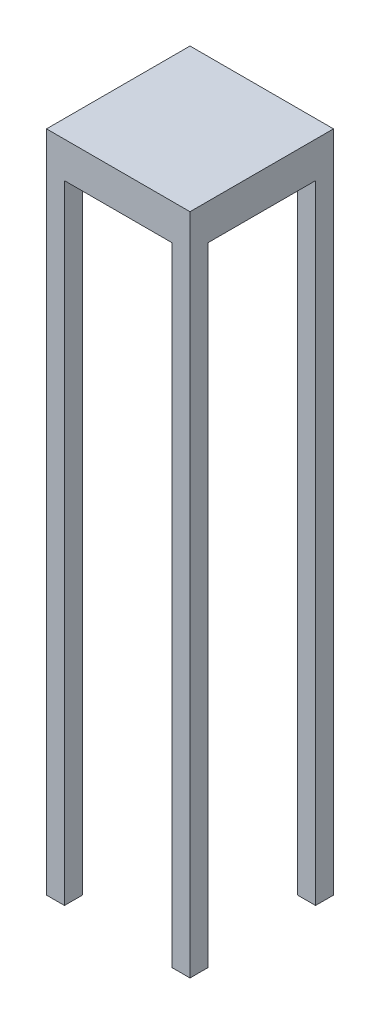
ISO-10303-21;
HEADER;
FILE_DESCRIPTION(('STEP AP214'),'2;1');
FILE_NAME('part.step','',(''),(''),'','','');
FILE_SCHEMA(('AUTOMOTIVE_DESIGN { 1 0 10303 214 1 1 1 1 }'));
ENDSEC;
DATA;
#1=APPLICATION_CONTEXT('core data for automotive mechanical design processes');
#2=APPLICATION_PROTOCOL_DEFINITION('international standard','automotive_design',2000,#1);
#3=PRODUCT_CONTEXT('',#1,'mechanical');
#4=PRODUCT('Part','Part','',(#3));
#5=PRODUCT_RELATED_PRODUCT_CATEGORY('part','',(#4));
#6=PRODUCT_DEFINITION_FORMATION('','',#4);
#7=PRODUCT_DEFINITION_CONTEXT('part definition',#1,'design');
#8=PRODUCT_DEFINITION('design','',#6,#7);
#9=PRODUCT_DEFINITION_SHAPE('','',#8);
#10=(LENGTH_UNIT() NAMED_UNIT(*) SI_UNIT(.MILLI.,.METRE.));
#11=(NAMED_UNIT(*) PLANE_ANGLE_UNIT() SI_UNIT($,.RADIAN.));
#12=(NAMED_UNIT(*) SI_UNIT($,.STERADIAN.) SOLID_ANGLE_UNIT());
#13=UNCERTAINTY_MEASURE_WITH_UNIT(LENGTH_MEASURE(1.E-05),#10,'distance_accuracy_value','');
#14=(GEOMETRIC_REPRESENTATION_CONTEXT(3) GLOBAL_UNCERTAINTY_ASSIGNED_CONTEXT((#13)) GLOBAL_UNIT_ASSIGNED_CONTEXT((#10,
#11,#12)) REPRESENTATION_CONTEXT('',''));
#15=CARTESIAN_POINT('',(0.,0.,0.));
#16=DIRECTION('',(0.,0.,1.));
#17=DIRECTION('',(1.,0.,0.));
#18=AXIS2_PLACEMENT_3D('',#15,#16,#17);
#19=CARTESIAN_POINT('',(0.,0.,0.));
#20=DIRECTION('',(0.,-1.,0.));
#21=DIRECTION('',(0.,0.,-1.));
#22=AXIS2_PLACEMENT_3D('',#19,#20,#21);
#23=PLANE('',#22);
#24=DIRECTION('',(0.,0.,-1.));
#25=VECTOR('',#24,1.);
#26=CARTESIAN_POINT('',(175.,0.,-200.));
#27=LINE('',#26,#25);
#28=CARTESIAN_POINT('',(175.,0.,-175.));
#29=VERTEX_POINT('',#28);
#30=CARTESIAN_POINT('',(175.,0.,-200.));
#31=VERTEX_POINT('',#30);
#32=EDGE_CURVE('E164',#29,#31,#27,.T.);
#33=ORIENTED_EDGE('',*,*,#32,.F.);
#34=DIRECTION('',(-1.,0.,0.));
#35=VECTOR('',#34,1.);
#36=CARTESIAN_POINT('',(200.,0.,-175.));
#37=LINE('',#36,#35);
#38=CARTESIAN_POINT('',(200.,0.,-175.));
#39=VERTEX_POINT('',#38);
#40=EDGE_CURVE('E276',#39,#29,#37,.T.);
#41=ORIENTED_EDGE('',*,*,#40,.F.);
#42=DIRECTION('',(0.,0.,-1.));
#43=VECTOR('',#42,1.);
#44=CARTESIAN_POINT('',(200.,0.,0.));
#45=LINE('',#44,#43);
#46=CARTESIAN_POINT('',(200.,0.,-25.));
#47=VERTEX_POINT('',#46);
#48=EDGE_CURVE('E170',#47,#39,#45,.T.);
#49=ORIENTED_EDGE('',*,*,#48,.F.);
#50=DIRECTION('',(1.,0.,0.));
#51=VECTOR('',#50,1.);
#52=CARTESIAN_POINT('',(200.,0.,-25.));
#53=LINE('',#52,#51);
#54=CARTESIAN_POINT('',(175.,0.,-25.));
#55=VERTEX_POINT('',#54);
#56=EDGE_CURVE('E202',#55,#47,#53,.T.);
#57=ORIENTED_EDGE('',*,*,#56,.F.);
#58=DIRECTION('',(0.,0.,-1.));
#59=VECTOR('',#58,1.);
#60=CARTESIAN_POINT('',(175.,0.,0.));
#61=LINE('',#60,#59);
#62=CARTESIAN_POINT('',(175.,0.,0.));
#63=VERTEX_POINT('',#62);
#64=EDGE_CURVE('E197',#63,#55,#61,.T.);
#65=ORIENTED_EDGE('',*,*,#64,.F.);
#66=DIRECTION('',(1.,0.,0.));
#67=VECTOR('',#66,1.);
#68=CARTESIAN_POINT('',(0.,0.,0.));
#69=LINE('',#68,#67);
#70=CARTESIAN_POINT('',(25.,0.,0.));
#71=VERTEX_POINT('',#70);
#72=EDGE_CURVE('E253',#71,#63,#69,.T.);
#73=ORIENTED_EDGE('',*,*,#72,.F.);
#74=DIRECTION('',(0.,0.,1.));
#75=VECTOR('',#74,1.);
#76=CARTESIAN_POINT('',(25.,0.,0.));
#77=LINE('',#76,#75);
#78=CARTESIAN_POINT('',(25.,0.,-25.));
#79=VERTEX_POINT('',#78);
#80=EDGE_CURVE('E220',#79,#71,#77,.T.);
#81=ORIENTED_EDGE('',*,*,#80,.F.);
#82=DIRECTION('',(1.,0.,0.));
#83=VECTOR('',#82,1.);
#84=CARTESIAN_POINT('',(0.,0.,-25.));
#85=LINE('',#84,#83);
#86=CARTESIAN_POINT('',(0.,0.,-25.));
#87=VERTEX_POINT('',#86);
#88=EDGE_CURVE('E215',#87,#79,#85,.T.);
#89=ORIENTED_EDGE('',*,*,#88,.F.);
#90=DIRECTION('',(0.,0.,1.));
#91=VECTOR('',#90,1.);
#92=CARTESIAN_POINT('',(0.,0.,0.));
#93=LINE('',#92,#91);
#94=CARTESIAN_POINT('',(0.,0.,-175.));
#95=VERTEX_POINT('',#94);
#96=EDGE_CURVE('E240',#95,#87,#93,.T.);
#97=ORIENTED_EDGE('',*,*,#96,.F.);
#98=DIRECTION('',(-1.,0.,0.));
#99=VECTOR('',#98,1.);
#100=CARTESIAN_POINT('',(0.,0.,-175.));
#101=LINE('',#100,#99);
#102=CARTESIAN_POINT('',(25.,0.,-175.));
#103=VERTEX_POINT('',#102);
#104=EDGE_CURVE('E173',#103,#95,#101,.T.);
#105=ORIENTED_EDGE('',*,*,#104,.F.);
#106=DIRECTION('',(0.,0.,1.));
#107=VECTOR('',#106,1.);
#108=CARTESIAN_POINT('',(25.,0.,-200.));
#109=LINE('',#108,#107);
#110=CARTESIAN_POINT('',(25.,0.,-200.));
#111=VERTEX_POINT('',#110);
#112=EDGE_CURVE('E171',#111,#103,#109,.T.);
#113=ORIENTED_EDGE('',*,*,#112,.F.);
#114=DIRECTION('',(-1.,0.,0.));
#115=VECTOR('',#114,1.);
#116=CARTESIAN_POINT('',(0.,0.,-200.));
#117=LINE('',#116,#115);
#118=EDGE_CURVE('E245',#31,#111,#117,.T.);
#119=ORIENTED_EDGE('',*,*,#118,.F.);
#120=EDGE_LOOP('',(#33,#41,#49,#57,#65,#73,#81,#89,#97,#105,#113,#119));
#121=FACE_BOUND('',#120,.T.);
#122=ADVANCED_FACE('F32',(#121),#23,.T.);
#123=CARTESIAN_POINT('',(0.,50.,0.));
#124=DIRECTION('',(1.,0.,0.));
#125=DIRECTION('',(0.,0.,-1.));
#126=AXIS2_PLACEMENT_3D('',#123,#124,#125);
#127=PLANE('',#126);
#128=DIRECTION('',(0.,-1.,0.));
#129=VECTOR('',#128,1.);
#130=CARTESIAN_POINT('',(0.,50.,-200.));
#131=LINE('',#130,#129);
#132=CARTESIAN_POINT('',(0.,50.,-200.));
#133=VERTEX_POINT('',#132);
#134=CARTESIAN_POINT('',(0.,-875.,-200.));
#135=VERTEX_POINT('',#134);
#136=EDGE_CURVE('E251',#133,#135,#131,.T.);
#137=ORIENTED_EDGE('',*,*,#136,.T.);
#138=DIRECTION('',(0.,0.,-1.));
#139=VECTOR('',#138,1.);
#140=CARTESIAN_POINT('',(0.,-875.,-200.));
#141=LINE('',#140,#139);
#142=CARTESIAN_POINT('',(0.,-875.,-175.));
#143=VERTEX_POINT('',#142);
#144=EDGE_CURVE('E178',#143,#135,#141,.T.);
#145=ORIENTED_EDGE('',*,*,#144,.F.);
#146=DIRECTION('',(0.,1.,0.));
#147=VECTOR('',#146,1.);
#148=CARTESIAN_POINT('',(0.,-875.,-175.));
#149=LINE('',#148,#147);
#150=EDGE_CURVE('E186',#143,#95,#149,.T.);
#151=ORIENTED_EDGE('',*,*,#150,.T.);
#152=ORIENTED_EDGE('',*,*,#96,.T.);
#153=DIRECTION('',(0.,1.,0.));
#154=VECTOR('',#153,1.);
#155=CARTESIAN_POINT('',(0.,-875.,-25.));
#156=LINE('',#155,#154);
#157=CARTESIAN_POINT('',(0.,-875.,-25.));
#158=VERTEX_POINT('',#157);
#159=EDGE_CURVE('E237',#158,#87,#156,.T.);
#160=ORIENTED_EDGE('',*,*,#159,.F.);
#161=DIRECTION('',(0.,0.,-1.));
#162=VECTOR('',#161,1.);
#163=CARTESIAN_POINT('',(0.,-875.,0.));
#164=LINE('',#163,#162);
#165=CARTESIAN_POINT('',(0.,-875.,0.));
#166=VERTEX_POINT('',#165);
#167=EDGE_CURVE('E216',#166,#158,#164,.T.);
#168=ORIENTED_EDGE('',*,*,#167,.F.);
#169=DIRECTION('',(0.,-1.,0.));
#170=VECTOR('',#169,1.);
#171=CARTESIAN_POINT('',(0.,50.,0.));
#172=LINE('',#171,#170);
#173=CARTESIAN_POINT('',(0.,50.,0.));
#174=VERTEX_POINT('',#173);
#175=EDGE_CURVE('E11',#174,#166,#172,.T.);
#176=ORIENTED_EDGE('',*,*,#175,.F.);
#177=DIRECTION('',(0.,0.,1.));
#178=VECTOR('',#177,1.);
#179=CARTESIAN_POINT('',(0.,50.,0.));
#180=LINE('',#179,#178);
#181=EDGE_CURVE('E241',#133,#174,#180,.T.);
#182=ORIENTED_EDGE('',*,*,#181,.F.);
#183=EDGE_LOOP('',(#137,#145,#151,#152,#160,#168,#176,#182));
#184=FACE_BOUND('',#183,.T.);
#185=ADVANCED_FACE('F34',(#184),#127,.F.);
#186=CARTESIAN_POINT('',(0.,50.,0.));
#187=DIRECTION('',(0.,0.,-1.));
#188=DIRECTION('',(-1.,0.,0.));
#189=AXIS2_PLACEMENT_3D('',#186,#187,#188);
#190=PLANE('',#189);
#191=ORIENTED_EDGE('',*,*,#175,.T.);
#192=DIRECTION('',(-1.,0.,0.));
#193=VECTOR('',#192,1.);
#194=CARTESIAN_POINT('',(0.,-875.,0.));
#195=LINE('',#194,#193);
#196=CARTESIAN_POINT('',(25.,-875.,0.));
#197=VERTEX_POINT('',#196);
#198=EDGE_CURVE('E224',#197,#166,#195,.T.);
#199=ORIENTED_EDGE('',*,*,#198,.F.);
#200=DIRECTION('',(0.,1.,0.));
#201=VECTOR('',#200,1.);
#202=CARTESIAN_POINT('',(25.,-875.,0.));
#203=LINE('',#202,#201);
#204=EDGE_CURVE('E227',#197,#71,#203,.T.);
#205=ORIENTED_EDGE('',*,*,#204,.T.);
#206=ORIENTED_EDGE('',*,*,#72,.T.);
#207=DIRECTION('',(0.,1.,0.));
#208=VECTOR('',#207,1.);
#209=CARTESIAN_POINT('',(175.,-875.,0.));
#210=LINE('',#209,#208);
#211=CARTESIAN_POINT('',(175.,-875.,0.));
#212=VERTEX_POINT('',#211);
#213=EDGE_CURVE('E213',#212,#63,#210,.T.);
#214=ORIENTED_EDGE('',*,*,#213,.F.);
#215=DIRECTION('',(-1.,0.,0.));
#216=VECTOR('',#215,1.);
#217=CARTESIAN_POINT('',(200.,-875.,0.));
#218=LINE('',#217,#216);
#219=CARTESIAN_POINT('',(200.,-875.,0.));
#220=VERTEX_POINT('',#219);
#221=EDGE_CURVE('E201',#220,#212,#218,.T.);
#222=ORIENTED_EDGE('',*,*,#221,.F.);
#223=DIRECTION('',(0.,-1.,0.));
#224=VECTOR('',#223,1.);
#225=CARTESIAN_POINT('',(200.,50.,0.));
#226=LINE('',#225,#224);
#227=CARTESIAN_POINT('',(200.,50.,0.));
#228=VERTEX_POINT('',#227);
#229=EDGE_CURVE('E40',#228,#220,#226,.T.);
#230=ORIENTED_EDGE('',*,*,#229,.F.);
#231=DIRECTION('',(1.,0.,0.));
#232=VECTOR('',#231,1.);
#233=CARTESIAN_POINT('',(0.,50.,0.));
#234=LINE('',#233,#232);
#235=EDGE_CURVE('E244',#174,#228,#234,.T.);
#236=ORIENTED_EDGE('',*,*,#235,.F.);
#237=EDGE_LOOP('',(#191,#199,#205,#206,#214,#222,#230,#236));
#238=FACE_BOUND('',#237,.T.);
#239=ADVANCED_FACE('F266',(#238),#190,.F.);
#240=CARTESIAN_POINT('',(200.,50.,0.));
#241=DIRECTION('',(-1.,0.,0.));
#242=DIRECTION('',(0.,0.,1.));
#243=AXIS2_PLACEMENT_3D('',#240,#241,#242);
#244=PLANE('',#243);
#245=ORIENTED_EDGE('',*,*,#229,.T.);
#246=DIRECTION('',(0.,0.,1.));
#247=VECTOR('',#246,1.);
#248=CARTESIAN_POINT('',(200.,-875.,0.));
#249=LINE('',#248,#247);
#250=CARTESIAN_POINT('',(200.,-875.,-25.));
#251=VERTEX_POINT('',#250);
#252=EDGE_CURVE('E198',#251,#220,#249,.T.);
#253=ORIENTED_EDGE('',*,*,#252,.F.);
#254=DIRECTION('',(0.,1.,0.));
#255=VECTOR('',#254,1.);
#256=CARTESIAN_POINT('',(200.,-875.,-25.));
#257=LINE('',#256,#255);
#258=EDGE_CURVE('E208',#251,#47,#257,.T.);
#259=ORIENTED_EDGE('',*,*,#258,.T.);
#260=ORIENTED_EDGE('',*,*,#48,.T.);
#261=DIRECTION('',(0.,1.,0.));
#262=VECTOR('',#261,1.);
#263=CARTESIAN_POINT('',(200.,-875.,-175.));
#264=LINE('',#263,#262);
#265=CARTESIAN_POINT('',(200.,-875.,-175.));
#266=VERTEX_POINT('',#265);
#267=EDGE_CURVE('E149',#266,#39,#264,.T.);
#268=ORIENTED_EDGE('',*,*,#267,.F.);
#269=DIRECTION('',(0.,0.,1.));
#270=VECTOR('',#269,1.);
#271=CARTESIAN_POINT('',(200.,-875.,-200.));
#272=LINE('',#271,#270);
#273=CARTESIAN_POINT('',(200.,-875.,-200.));
#274=VERTEX_POINT('',#273);
#275=EDGE_CURVE('E156',#274,#266,#272,.T.);
#276=ORIENTED_EDGE('',*,*,#275,.F.);
#277=DIRECTION('',(0.,-1.,0.));
#278=VECTOR('',#277,1.);
#279=CARTESIAN_POINT('',(200.,50.,-200.));
#280=LINE('',#279,#278);
#281=CARTESIAN_POINT('',(200.,50.,-200.));
#282=VERTEX_POINT('',#281);
#283=EDGE_CURVE('E259',#282,#274,#280,.T.);
#284=ORIENTED_EDGE('',*,*,#283,.F.);
#285=DIRECTION('',(0.,0.,-1.));
#286=VECTOR('',#285,1.);
#287=CARTESIAN_POINT('',(200.,50.,0.));
#288=LINE('',#287,#286);
#289=EDGE_CURVE('E247',#228,#282,#288,.T.);
#290=ORIENTED_EDGE('',*,*,#289,.F.);
#291=EDGE_LOOP('',(#245,#253,#259,#260,#268,#276,#284,#290));
#292=FACE_BOUND('',#291,.T.);
#293=ADVANCED_FACE('F167',(#292),#244,.F.);
#294=CARTESIAN_POINT('',(0.,50.,-200.));
#295=DIRECTION('',(0.,0.,1.));
#296=DIRECTION('',(1.,0.,0.));
#297=AXIS2_PLACEMENT_3D('',#294,#295,#296);
#298=PLANE('',#297);
#299=ORIENTED_EDGE('',*,*,#283,.T.);
#300=DIRECTION('',(1.,0.,0.));
#301=VECTOR('',#300,1.);
#302=CARTESIAN_POINT('',(200.,-875.,-200.));
#303=LINE('',#302,#301);
#304=CARTESIAN_POINT('',(175.,-875.,-200.));
#305=VERTEX_POINT('',#304);
#306=EDGE_CURVE('E161',#305,#274,#303,.T.);
#307=ORIENTED_EDGE('',*,*,#306,.F.);
#308=DIRECTION('',(0.,1.,0.));
#309=VECTOR('',#308,1.);
#310=CARTESIAN_POINT('',(175.,-875.,-200.));
#311=LINE('',#310,#309);
#312=EDGE_CURVE('E47',#305,#31,#311,.T.);
#313=ORIENTED_EDGE('',*,*,#312,.T.);
#314=ORIENTED_EDGE('',*,*,#118,.T.);
#315=DIRECTION('',(0.,1.,0.));
#316=VECTOR('',#315,1.);
#317=CARTESIAN_POINT('',(25.,-875.,-200.));
#318=LINE('',#317,#316);
#319=CARTESIAN_POINT('',(25.,-875.,-200.));
#320=VERTEX_POINT('',#319);
#321=EDGE_CURVE('E194',#320,#111,#318,.T.);
#322=ORIENTED_EDGE('',*,*,#321,.F.);
#323=DIRECTION('',(1.,0.,0.));
#324=VECTOR('',#323,1.);
#325=CARTESIAN_POINT('',(0.,-875.,-200.));
#326=LINE('',#325,#324);
#327=EDGE_CURVE('E181',#135,#320,#326,.T.);
#328=ORIENTED_EDGE('',*,*,#327,.F.);
#329=ORIENTED_EDGE('',*,*,#136,.F.);
#330=DIRECTION('',(-1.,0.,0.));
#331=VECTOR('',#330,1.);
#332=CARTESIAN_POINT('',(0.,50.,-200.));
#333=LINE('',#332,#331);
#334=EDGE_CURVE('E249',#282,#133,#333,.T.);
#335=ORIENTED_EDGE('',*,*,#334,.F.);
#336=EDGE_LOOP('',(#299,#307,#313,#314,#322,#328,#329,#335));
#337=FACE_BOUND('',#336,.T.);
#338=ADVANCED_FACE('F284',(#337),#298,.F.);
#339=CARTESIAN_POINT('',(0.,50.,0.));
#340=DIRECTION('',(0.,-1.,0.));
#341=DIRECTION('',(0.,0.,-1.));
#342=AXIS2_PLACEMENT_3D('',#339,#340,#341);
#343=PLANE('',#342);
#344=ORIENTED_EDGE('',*,*,#181,.T.);
#345=ORIENTED_EDGE('',*,*,#235,.T.);
#346=ORIENTED_EDGE('',*,*,#289,.T.);
#347=ORIENTED_EDGE('',*,*,#334,.T.);
#348=EDGE_LOOP('',(#344,#345,#346,#347));
#349=FACE_BOUND('',#348,.T.);
#350=ADVANCED_FACE('F290',(#349),#343,.F.);
#351=CARTESIAN_POINT('',(0.,-875.,-25.));
#352=DIRECTION('',(0.,0.,1.));
#353=DIRECTION('',(1.,0.,0.));
#354=AXIS2_PLACEMENT_3D('',#351,#352,#353);
#355=PLANE('',#354);
#356=ORIENTED_EDGE('',*,*,#88,.T.);
#357=DIRECTION('',(0.,1.,0.));
#358=VECTOR('',#357,1.);
#359=CARTESIAN_POINT('',(25.,-875.,-25.));
#360=LINE('',#359,#358);
#361=CARTESIAN_POINT('',(25.,-875.,-25.));
#362=VERTEX_POINT('',#361);
#363=EDGE_CURVE('E234',#362,#79,#360,.T.);
#364=ORIENTED_EDGE('',*,*,#363,.F.);
#365=DIRECTION('',(1.,0.,0.));
#366=VECTOR('',#365,1.);
#367=CARTESIAN_POINT('',(0.,-875.,-25.));
#368=LINE('',#367,#366);
#369=EDGE_CURVE('E219',#158,#362,#368,.T.);
#370=ORIENTED_EDGE('',*,*,#369,.F.);
#371=ORIENTED_EDGE('',*,*,#159,.T.);
#372=EDGE_LOOP('',(#356,#364,#370,#371));
#373=FACE_BOUND('',#372,.T.);
#374=ADVANCED_FACE('F303',(#373),#355,.F.);
#375=CARTESIAN_POINT('',(25.,-875.,0.));
#376=DIRECTION('',(-1.,0.,0.));
#377=DIRECTION('',(0.,0.,1.));
#378=AXIS2_PLACEMENT_3D('',#375,#376,#377);
#379=PLANE('',#378);
#380=ORIENTED_EDGE('',*,*,#80,.T.);
#381=ORIENTED_EDGE('',*,*,#204,.F.);
#382=DIRECTION('',(0.,0.,1.));
#383=VECTOR('',#382,1.);
#384=CARTESIAN_POINT('',(25.,-875.,0.));
#385=LINE('',#384,#383);
#386=EDGE_CURVE('E222',#362,#197,#385,.T.);
#387=ORIENTED_EDGE('',*,*,#386,.F.);
#388=ORIENTED_EDGE('',*,*,#363,.T.);
#389=EDGE_LOOP('',(#380,#381,#387,#388));
#390=FACE_BOUND('',#389,.T.);
#391=ADVANCED_FACE('F306',(#390),#379,.F.);
#392=CARTESIAN_POINT('',(0.,-875.,0.));
#393=DIRECTION('',(0.,-1.,0.));
#394=DIRECTION('',(0.,0.,-1.));
#395=AXIS2_PLACEMENT_3D('',#392,#393,#394);
#396=PLANE('',#395);
#397=ORIENTED_EDGE('',*,*,#167,.T.);
#398=ORIENTED_EDGE('',*,*,#369,.T.);
#399=ORIENTED_EDGE('',*,*,#386,.T.);
#400=ORIENTED_EDGE('',*,*,#198,.T.);
#401=EDGE_LOOP('',(#397,#398,#399,#400));
#402=FACE_BOUND('',#401,.T.);
#403=ADVANCED_FACE('F296',(#402),#396,.T.);
#404=CARTESIAN_POINT('',(175.,-875.,0.));
#405=DIRECTION('',(1.,0.,0.));
#406=DIRECTION('',(0.,0.,-1.));
#407=AXIS2_PLACEMENT_3D('',#404,#405,#406);
#408=PLANE('',#407);
#409=ORIENTED_EDGE('',*,*,#64,.T.);
#410=DIRECTION('',(0.,1.,0.));
#411=VECTOR('',#410,1.);
#412=CARTESIAN_POINT('',(175.,-875.,-25.));
#413=LINE('',#412,#411);
#414=CARTESIAN_POINT('',(175.,-875.,-25.));
#415=VERTEX_POINT('',#414);
#416=EDGE_CURVE('E55',#415,#55,#413,.T.);
#417=ORIENTED_EDGE('',*,*,#416,.F.);
#418=DIRECTION('',(0.,0.,-1.));
#419=VECTOR('',#418,1.);
#420=CARTESIAN_POINT('',(175.,-875.,0.));
#421=LINE('',#420,#419);
#422=EDGE_CURVE('E204',#212,#415,#421,.T.);
#423=ORIENTED_EDGE('',*,*,#422,.F.);
#424=ORIENTED_EDGE('',*,*,#213,.T.);
#425=EDGE_LOOP('',(#409,#417,#423,#424));
#426=FACE_BOUND('',#425,.T.);
#427=ADVANCED_FACE('F308',(#426),#408,.F.);
#428=CARTESIAN_POINT('',(200.,-875.,-25.));
#429=DIRECTION('',(0.,0.,1.));
#430=DIRECTION('',(1.,0.,0.));
#431=AXIS2_PLACEMENT_3D('',#428,#429,#430);
#432=PLANE('',#431);
#433=ORIENTED_EDGE('',*,*,#56,.T.);
#434=ORIENTED_EDGE('',*,*,#258,.F.);
#435=DIRECTION('',(1.,0.,0.));
#436=VECTOR('',#435,1.);
#437=CARTESIAN_POINT('',(200.,-875.,-25.));
#438=LINE('',#437,#436);
#439=EDGE_CURVE('E206',#415,#251,#438,.T.);
#440=ORIENTED_EDGE('',*,*,#439,.F.);
#441=ORIENTED_EDGE('',*,*,#416,.T.);
#442=EDGE_LOOP('',(#433,#434,#440,#441));
#443=FACE_BOUND('',#442,.T.);
#444=ADVANCED_FACE('F271',(#443),#432,.F.);
#445=CARTESIAN_POINT('',(0.,-875.,0.));
#446=DIRECTION('',(0.,1.,0.));
#447=DIRECTION('',(0.,0.,1.));
#448=AXIS2_PLACEMENT_3D('',#445,#446,#447);
#449=PLANE('',#448);
#450=ORIENTED_EDGE('',*,*,#252,.T.);
#451=ORIENTED_EDGE('',*,*,#221,.T.);
#452=ORIENTED_EDGE('',*,*,#422,.T.);
#453=ORIENTED_EDGE('',*,*,#439,.T.);
#454=EDGE_LOOP('',(#450,#451,#452,#453));
#455=FACE_BOUND('',#454,.T.);
#456=ADVANCED_FACE('F269',(#455),#449,.F.);
#457=CARTESIAN_POINT('',(25.,-875.,-200.));
#458=DIRECTION('',(-1.,0.,0.));
#459=DIRECTION('',(0.,0.,1.));
#460=AXIS2_PLACEMENT_3D('',#457,#458,#459);
#461=PLANE('',#460);
#462=ORIENTED_EDGE('',*,*,#112,.T.);
#463=DIRECTION('',(0.,1.,0.));
#464=VECTOR('',#463,1.);
#465=CARTESIAN_POINT('',(25.,-875.,-175.));
#466=LINE('',#465,#464);
#467=CARTESIAN_POINT('',(25.,-875.,-175.));
#468=VERTEX_POINT('',#467);
#469=EDGE_CURVE('E191',#468,#103,#466,.T.);
#470=ORIENTED_EDGE('',*,*,#469,.F.);
#471=DIRECTION('',(0.,0.,1.));
#472=VECTOR('',#471,1.);
#473=CARTESIAN_POINT('',(25.,-875.,-200.));
#474=LINE('',#473,#472);
#475=EDGE_CURVE('E183',#320,#468,#474,.T.);
#476=ORIENTED_EDGE('',*,*,#475,.F.);
#477=ORIENTED_EDGE('',*,*,#321,.T.);
#478=EDGE_LOOP('',(#462,#470,#476,#477));
#479=FACE_BOUND('',#478,.T.);
#480=ADVANCED_FACE('F380',(#479),#461,.F.);
#481=CARTESIAN_POINT('',(0.,-875.,-175.));
#482=DIRECTION('',(0.,0.,-1.));
#483=DIRECTION('',(-1.,0.,0.));
#484=AXIS2_PLACEMENT_3D('',#481,#482,#483);
#485=PLANE('',#484);
#486=ORIENTED_EDGE('',*,*,#104,.T.);
#487=ORIENTED_EDGE('',*,*,#150,.F.);
#488=DIRECTION('',(-1.,0.,0.));
#489=VECTOR('',#488,1.);
#490=CARTESIAN_POINT('',(0.,-875.,-175.));
#491=LINE('',#490,#489);
#492=EDGE_CURVE('E185',#468,#143,#491,.T.);
#493=ORIENTED_EDGE('',*,*,#492,.F.);
#494=ORIENTED_EDGE('',*,*,#469,.T.);
#495=EDGE_LOOP('',(#486,#487,#493,#494));
#496=FACE_BOUND('',#495,.T.);
#497=ADVANCED_FACE('F389',(#496),#485,.F.);
#498=CARTESIAN_POINT('',(0.,-875.,0.));
#499=DIRECTION('',(0.,1.,0.));
#500=DIRECTION('',(0.,0.,1.));
#501=AXIS2_PLACEMENT_3D('',#498,#499,#500);
#502=PLANE('',#501);
#503=ORIENTED_EDGE('',*,*,#144,.T.);
#504=ORIENTED_EDGE('',*,*,#327,.T.);
#505=ORIENTED_EDGE('',*,*,#475,.T.);
#506=ORIENTED_EDGE('',*,*,#492,.T.);
#507=EDGE_LOOP('',(#503,#504,#505,#506));
#508=FACE_BOUND('',#507,.T.);
#509=ADVANCED_FACE('F399',(#508),#502,.F.);
#510=CARTESIAN_POINT('',(200.,-875.,-175.));
#511=DIRECTION('',(0.,0.,-1.));
#512=DIRECTION('',(-1.,0.,0.));
#513=AXIS2_PLACEMENT_3D('',#510,#511,#512);
#514=PLANE('',#513);
#515=ORIENTED_EDGE('',*,*,#40,.T.);
#516=DIRECTION('',(0.,1.,0.));
#517=VECTOR('',#516,1.);
#518=CARTESIAN_POINT('',(175.,-875.,-175.));
#519=LINE('',#518,#517);
#520=CARTESIAN_POINT('',(175.,-875.,-175.));
#521=VERTEX_POINT('',#520);
#522=EDGE_CURVE('E152',#521,#29,#519,.T.);
#523=ORIENTED_EDGE('',*,*,#522,.F.);
#524=DIRECTION('',(-1.,0.,0.));
#525=VECTOR('',#524,1.);
#526=CARTESIAN_POINT('',(200.,-875.,-175.));
#527=LINE('',#526,#525);
#528=EDGE_CURVE('E145',#266,#521,#527,.T.);
#529=ORIENTED_EDGE('',*,*,#528,.F.);
#530=ORIENTED_EDGE('',*,*,#267,.T.);
#531=EDGE_LOOP('',(#515,#523,#529,#530));
#532=FACE_BOUND('',#531,.T.);
#533=ADVANCED_FACE('F147',(#532),#514,.F.);
#534=CARTESIAN_POINT('',(175.,-875.,-200.));
#535=DIRECTION('',(1.,0.,0.));
#536=DIRECTION('',(0.,0.,-1.));
#537=AXIS2_PLACEMENT_3D('',#534,#535,#536);
#538=PLANE('',#537);
#539=ORIENTED_EDGE('',*,*,#32,.T.);
#540=ORIENTED_EDGE('',*,*,#312,.F.);
#541=DIRECTION('',(0.,0.,-1.));
#542=VECTOR('',#541,1.);
#543=CARTESIAN_POINT('',(175.,-875.,-200.));
#544=LINE('',#543,#542);
#545=EDGE_CURVE('E155',#521,#305,#544,.T.);
#546=ORIENTED_EDGE('',*,*,#545,.F.);
#547=ORIENTED_EDGE('',*,*,#522,.T.);
#548=EDGE_LOOP('',(#539,#540,#546,#547));
#549=FACE_BOUND('',#548,.T.);
#550=ADVANCED_FACE('F283',(#549),#538,.F.);
#551=CARTESIAN_POINT('',(0.,-875.,0.));
#552=DIRECTION('',(0.,-1.,0.));
#553=DIRECTION('',(0.,0.,-1.));
#554=AXIS2_PLACEMENT_3D('',#551,#552,#553);
#555=PLANE('',#554);
#556=ORIENTED_EDGE('',*,*,#275,.T.);
#557=ORIENTED_EDGE('',*,*,#528,.T.);
#558=ORIENTED_EDGE('',*,*,#545,.T.);
#559=ORIENTED_EDGE('',*,*,#306,.T.);
#560=EDGE_LOOP('',(#556,#557,#558,#559));
#561=FACE_BOUND('',#560,.T.);
#562=ADVANCED_FACE('F160',(#561),#555,.T.);
#563=CLOSED_SHELL('',(#122,#185,#239,#293,#338,#350,#374,#391,#403,#427,#444,#456,#480,#497,
#509,#533,#550,#562));
#564=MANIFOLD_SOLID_BREP('B2',#563);
#565=ADVANCED_BREP_SHAPE_REPRESENTATION('',(#18,#564),#14);
#566=SHAPE_DEFINITION_REPRESENTATION(#9,#565);
ENDSEC;
END-ISO-10303-21;
